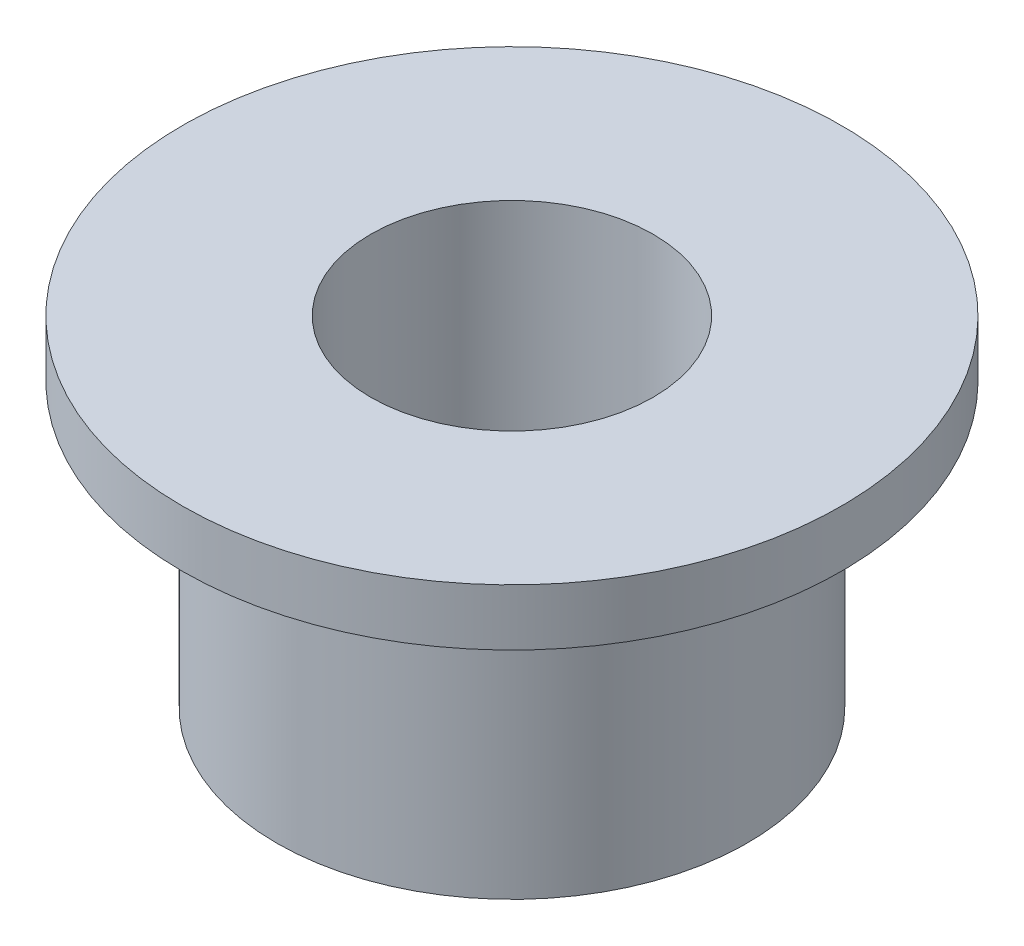
ISO-10303-21;
HEADER;
FILE_DESCRIPTION(('STEP AP214'),'2;1');
FILE_NAME('part.step','',(''),(''),'','','');
FILE_SCHEMA(('AUTOMOTIVE_DESIGN { 1 0 10303 214 1 1 1 1 }'));
ENDSEC;
DATA;
#1=APPLICATION_CONTEXT('core data for automotive mechanical design processes');
#2=APPLICATION_PROTOCOL_DEFINITION('international standard','automotive_design',2000,#1);
#3=PRODUCT_CONTEXT('',#1,'mechanical');
#4=PRODUCT('Part','Part','',(#3));
#5=PRODUCT_RELATED_PRODUCT_CATEGORY('part','',(#4));
#6=PRODUCT_DEFINITION_FORMATION('','',#4);
#7=PRODUCT_DEFINITION_CONTEXT('part definition',#1,'design');
#8=PRODUCT_DEFINITION('design','',#6,#7);
#9=PRODUCT_DEFINITION_SHAPE('','',#8);
#10=(LENGTH_UNIT() NAMED_UNIT(*) SI_UNIT(.MILLI.,.METRE.));
#11=(NAMED_UNIT(*) PLANE_ANGLE_UNIT() SI_UNIT($,.RADIAN.));
#12=(NAMED_UNIT(*) SI_UNIT($,.STERADIAN.) SOLID_ANGLE_UNIT());
#13=UNCERTAINTY_MEASURE_WITH_UNIT(LENGTH_MEASURE(1.E-05),#10,'distance_accuracy_value','');
#14=(GEOMETRIC_REPRESENTATION_CONTEXT(3) GLOBAL_UNCERTAINTY_ASSIGNED_CONTEXT((#13)) GLOBAL_UNIT_ASSIGNED_CONTEXT((#10,
#11,#12)) REPRESENTATION_CONTEXT('',''));
#15=CARTESIAN_POINT('',(0.,0.,0.));
#16=DIRECTION('',(0.,0.,1.));
#17=DIRECTION('',(1.,0.,0.));
#18=AXIS2_PLACEMENT_3D('',#15,#16,#17);
#19=CARTESIAN_POINT('',(0.,0.,0.));
#20=DIRECTION('',(0.,1.,0.));
#21=DIRECTION('',(0.,0.,1.));
#22=AXIS2_PLACEMENT_3D('',#19,#20,#21);
#23=PLANE('',#22);
#24=CARTESIAN_POINT('',(0.,0.,0.));
#25=DIRECTION('',(0.,1.,0.));
#26=DIRECTION('',(0.,0.,1.));
#27=AXIS2_PLACEMENT_3D('',#24,#25,#26);
#28=CIRCLE('',#27,2.5);
#29=CARTESIAN_POINT('',(0.,0.,2.5));
#30=VERTEX_POINT('',#29);
#31=EDGE_CURVE('E38',#30,#30,#28,.T.);
#32=ORIENTED_EDGE('',*,*,#31,.F.);
#33=EDGE_LOOP('',(#32));
#34=FACE_BOUND('',#33,.T.);
#35=CARTESIAN_POINT('',(0.,0.,0.));
#36=DIRECTION('',(0.,1.,0.));
#37=DIRECTION('',(0.,0.,1.));
#38=AXIS2_PLACEMENT_3D('',#35,#36,#37);
#39=CIRCLE('',#38,1.5);
#40=CARTESIAN_POINT('',(0.,0.,1.5));
#41=VERTEX_POINT('',#40);
#42=EDGE_CURVE('E45',#41,#41,#39,.T.);
#43=ORIENTED_EDGE('',*,*,#42,.T.);
#44=EDGE_LOOP('',(#43));
#45=FACE_BOUND('',#44,.T.);
#46=ADVANCED_FACE('F34',(#34,#45),#23,.F.);
#47=CARTESIAN_POINT('',(0.,3.,0.));
#48=DIRECTION('',(0.,-1.,0.));
#49=DIRECTION('',(0.,0.,-1.));
#50=AXIS2_PLACEMENT_3D('',#47,#48,#49);
#51=CYLINDRICAL_SURFACE('',#50,2.5);
#52=CARTESIAN_POINT('',(0.,3.,0.));
#53=DIRECTION('',(0.,1.,0.));
#54=DIRECTION('',(0.,0.,1.));
#55=AXIS2_PLACEMENT_3D('',#52,#53,#54);
#56=CIRCLE('',#55,2.5);
#57=CARTESIAN_POINT('',(0.,3.,2.5));
#58=VERTEX_POINT('',#57);
#59=EDGE_CURVE('E10',#58,#58,#56,.T.);
#60=ORIENTED_EDGE('',*,*,#59,.F.);
#61=EDGE_LOOP('',(#60));
#62=FACE_BOUND('',#61,.T.);
#63=ORIENTED_EDGE('',*,*,#31,.T.);
#64=EDGE_LOOP('',(#63));
#65=FACE_BOUND('',#64,.T.);
#66=ADVANCED_FACE('F36',(#62,#65),#51,.T.);
#67=CARTESIAN_POINT('',(0.,3.,0.));
#68=DIRECTION('',(0.,-1.,0.));
#69=DIRECTION('',(0.,0.,-1.));
#70=AXIS2_PLACEMENT_3D('',#67,#68,#69);
#71=CYLINDRICAL_SURFACE('',#70,1.5);
#72=ORIENTED_EDGE('',*,*,#42,.F.);
#73=EDGE_LOOP('',(#72));
#74=FACE_BOUND('',#73,.T.);
#75=CARTESIAN_POINT('',(0.,3.6,0.));
#76=DIRECTION('',(0.,1.,0.));
#77=DIRECTION('',(0.,0.,1.));
#78=AXIS2_PLACEMENT_3D('',#75,#76,#77);
#79=CIRCLE('',#78,1.5);
#80=CARTESIAN_POINT('',(0.,3.6,1.5));
#81=VERTEX_POINT('',#80);
#82=EDGE_CURVE('E53',#81,#81,#79,.T.);
#83=ORIENTED_EDGE('',*,*,#82,.T.);
#84=EDGE_LOOP('',(#83));
#85=FACE_BOUND('',#84,.T.);
#86=ADVANCED_FACE('F59',(#74,#85),#71,.F.);
#87=CARTESIAN_POINT('',(0.,3.6,0.));
#88=DIRECTION('',(0.,1.,0.));
#89=DIRECTION('',(0.,0.,1.));
#90=AXIS2_PLACEMENT_3D('',#87,#88,#89);
#91=PLANE('',#90);
#92=CARTESIAN_POINT('',(0.,3.6,0.));
#93=DIRECTION('',(0.,1.,0.));
#94=DIRECTION('',(0.,0.,1.));
#95=AXIS2_PLACEMENT_3D('',#92,#93,#94);
#96=CIRCLE('',#95,3.5);
#97=CARTESIAN_POINT('',(0.,3.6,3.5));
#98=VERTEX_POINT('',#97);
#99=EDGE_CURVE('E49',#98,#98,#96,.T.);
#100=ORIENTED_EDGE('',*,*,#99,.T.);
#101=EDGE_LOOP('',(#100));
#102=FACE_BOUND('',#101,.T.);
#103=ORIENTED_EDGE('',*,*,#82,.F.);
#104=EDGE_LOOP('',(#103));
#105=FACE_BOUND('',#104,.T.);
#106=ADVANCED_FACE('F61',(#102,#105),#91,.T.);
#107=CARTESIAN_POINT('',(0.,3.,0.));
#108=DIRECTION('',(0.,1.,0.));
#109=DIRECTION('',(0.,0.,1.));
#110=AXIS2_PLACEMENT_3D('',#107,#108,#109);
#111=PLANE('',#110);
#112=ORIENTED_EDGE('',*,*,#59,.T.);
#113=EDGE_LOOP('',(#112));
#114=FACE_BOUND('',#113,.T.);
#115=CARTESIAN_POINT('',(0.,3.,0.));
#116=DIRECTION('',(0.,1.,0.));
#117=DIRECTION('',(0.,0.,1.));
#118=AXIS2_PLACEMENT_3D('',#115,#116,#117);
#119=CIRCLE('',#118,3.5);
#120=CARTESIAN_POINT('',(0.,3.,3.5));
#121=VERTEX_POINT('',#120);
#122=EDGE_CURVE('E50',#121,#121,#119,.T.);
#123=ORIENTED_EDGE('',*,*,#122,.F.);
#124=EDGE_LOOP('',(#123));
#125=FACE_BOUND('',#124,.T.);
#126=ADVANCED_FACE('F63',(#114,#125),#111,.F.);
#127=CARTESIAN_POINT('',(0.,3.6,0.));
#128=DIRECTION('',(0.,-1.,0.));
#129=DIRECTION('',(0.,0.,-1.));
#130=AXIS2_PLACEMENT_3D('',#127,#128,#129);
#131=CYLINDRICAL_SURFACE('',#130,3.5);
#132=ORIENTED_EDGE('',*,*,#99,.F.);
#133=EDGE_LOOP('',(#132));
#134=FACE_BOUND('',#133,.T.);
#135=ORIENTED_EDGE('',*,*,#122,.T.);
#136=EDGE_LOOP('',(#135));
#137=FACE_BOUND('',#136,.T.);
#138=ADVANCED_FACE('F70',(#134,#137),#131,.T.);
#139=CLOSED_SHELL('',(#46,#66,#86,#106,#126,#138));
#140=MANIFOLD_SOLID_BREP('B2',#139);
#141=ADVANCED_BREP_SHAPE_REPRESENTATION('',(#18,#140),#14);
#142=SHAPE_DEFINITION_REPRESENTATION(#9,#141);
ENDSEC;
END-ISO-10303-21;
